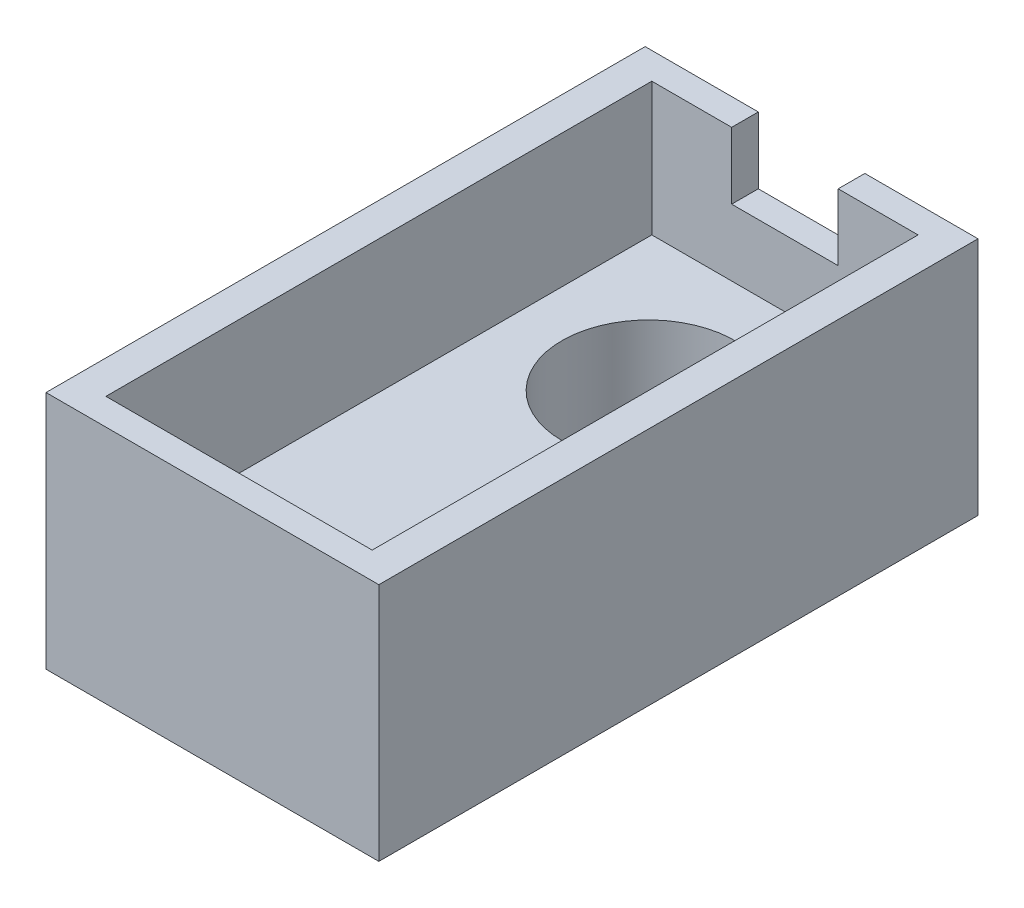
ISO-10303-21;
HEADER;
FILE_DESCRIPTION(('STEP AP214'),'2;1');
FILE_NAME('part.step','',(''),(''),'','','');
FILE_SCHEMA(('AUTOMOTIVE_DESIGN { 1 0 10303 214 1 1 1 1 }'));
ENDSEC;
DATA;
#1=APPLICATION_CONTEXT('core data for automotive mechanical design processes');
#2=APPLICATION_PROTOCOL_DEFINITION('international standard','automotive_design',2000,#1);
#3=PRODUCT_CONTEXT('',#1,'mechanical');
#4=PRODUCT('Part','Part','',(#3));
#5=PRODUCT_RELATED_PRODUCT_CATEGORY('part','',(#4));
#6=PRODUCT_DEFINITION_FORMATION('','',#4);
#7=PRODUCT_DEFINITION_CONTEXT('part definition',#1,'design');
#8=PRODUCT_DEFINITION('design','',#6,#7);
#9=PRODUCT_DEFINITION_SHAPE('','',#8);
#10=(LENGTH_UNIT() NAMED_UNIT(*) SI_UNIT(.MILLI.,.METRE.));
#11=(NAMED_UNIT(*) PLANE_ANGLE_UNIT() SI_UNIT($,.RADIAN.));
#12=(NAMED_UNIT(*) SI_UNIT($,.STERADIAN.) SOLID_ANGLE_UNIT());
#13=UNCERTAINTY_MEASURE_WITH_UNIT(LENGTH_MEASURE(1.E-05),#10,'distance_accuracy_value','');
#14=(GEOMETRIC_REPRESENTATION_CONTEXT(3) GLOBAL_UNCERTAINTY_ASSIGNED_CONTEXT((#13)) GLOBAL_UNIT_ASSIGNED_CONTEXT((#10,
#11,#12)) REPRESENTATION_CONTEXT('',''));
#15=CARTESIAN_POINT('',(0.,0.,0.));
#16=DIRECTION('',(0.,0.,1.));
#17=DIRECTION('',(1.,0.,0.));
#18=AXIS2_PLACEMENT_3D('',#15,#16,#17);
#19=CARTESIAN_POINT('',(12.5,-4.24264068711929,-32.75));
#20=DIRECTION('',(0.,1.,0.));
#21=DIRECTION('',(0.,0.,1.));
#22=AXIS2_PLACEMENT_3D('',#19,#20,#21);
#23=CYLINDRICAL_SURFACE('',#22,1.5);
#24=CARTESIAN_POINT('',(12.5,0.,-32.75));
#25=DIRECTION('',(0.,-1.,0.));
#26=DIRECTION('',(0.,0.,-1.));
#27=AXIS2_PLACEMENT_3D('',#24,#25,#26);
#28=CIRCLE('',#27,1.5);
#29=CARTESIAN_POINT('',(12.5,0.,-34.25));
#30=VERTEX_POINT('',#29);
#31=EDGE_CURVE('E189',#30,#30,#28,.F.);
#32=ORIENTED_EDGE('',*,*,#31,.F.);
#33=EDGE_LOOP('',(#32));
#34=FACE_BOUND('',#33,.T.);
#35=CARTESIAN_POINT('',(12.5,1.,-32.75));
#36=DIRECTION('',(0.,1.,0.));
#37=DIRECTION('',(0.,0.,1.));
#38=AXIS2_PLACEMENT_3D('',#35,#36,#37);
#39=CIRCLE('',#38,1.5);
#40=CARTESIAN_POINT('',(12.5,1.,-31.25));
#41=VERTEX_POINT('',#40);
#42=EDGE_CURVE('E39',#41,#41,#39,.F.);
#43=ORIENTED_EDGE('',*,*,#42,.F.);
#44=EDGE_LOOP('',(#43));
#45=FACE_BOUND('',#44,.T.);
#46=ADVANCED_FACE('F35',(#34,#45),#23,.F.);
#47=CARTESIAN_POINT('',(0.,13.,0.));
#48=DIRECTION('',(1.,0.,0.));
#49=DIRECTION('',(0.,0.,-1.));
#50=AXIS2_PLACEMENT_3D('',#47,#48,#49);
#51=PLANE('',#50);
#52=DIRECTION('',(0.,0.,1.));
#53=VECTOR('',#52,1.);
#54=CARTESIAN_POINT('',(0.,0.,0.));
#55=LINE('',#54,#53);
#56=CARTESIAN_POINT('',(0.,0.,-45.));
#57=VERTEX_POINT('',#56);
#58=CARTESIAN_POINT('',(0.,0.,0.));
#59=VERTEX_POINT('',#58);
#60=EDGE_CURVE('E210',#57,#59,#55,.T.);
#61=ORIENTED_EDGE('',*,*,#60,.T.);
#62=DIRECTION('',(0.,-1.,0.));
#63=VECTOR('',#62,1.);
#64=CARTESIAN_POINT('',(0.,13.,0.));
#65=LINE('',#64,#63);
#66=CARTESIAN_POINT('',(0.,18.,0.));
#67=VERTEX_POINT('',#66);
#68=EDGE_CURVE('E11',#67,#59,#65,.T.);
#69=ORIENTED_EDGE('',*,*,#68,.F.);
#70=DIRECTION('',(0.,0.,1.));
#71=VECTOR('',#70,1.);
#72=CARTESIAN_POINT('',(0.,18.,0.));
#73=LINE('',#72,#71);
#74=CARTESIAN_POINT('',(0.,18.,-45.));
#75=VERTEX_POINT('',#74);
#76=EDGE_CURVE('E146',#75,#67,#73,.T.);
#77=ORIENTED_EDGE('',*,*,#76,.F.);
#78=DIRECTION('',(0.,-1.,0.));
#79=VECTOR('',#78,1.);
#80=CARTESIAN_POINT('',(0.,13.,-45.));
#81=LINE('',#80,#79);
#82=EDGE_CURVE('E142',#75,#57,#81,.T.);
#83=ORIENTED_EDGE('',*,*,#82,.T.);
#84=EDGE_LOOP('',(#61,#69,#77,#83));
#85=FACE_BOUND('',#84,.T.);
#86=ADVANCED_FACE('F37',(#85),#51,.F.);
#87=CARTESIAN_POINT('',(0.,13.,0.));
#88=DIRECTION('',(0.,0.,-1.));
#89=DIRECTION('',(-1.,0.,0.));
#90=AXIS2_PLACEMENT_3D('',#87,#88,#89);
#91=PLANE('',#90);
#92=DIRECTION('',(1.,0.,0.));
#93=VECTOR('',#92,1.);
#94=CARTESIAN_POINT('',(0.,0.,0.));
#95=LINE('',#94,#93);
#96=CARTESIAN_POINT('',(25.,0.,0.));
#97=VERTEX_POINT('',#96);
#98=EDGE_CURVE('E220',#59,#97,#95,.T.);
#99=ORIENTED_EDGE('',*,*,#98,.T.);
#100=DIRECTION('',(0.,-1.,0.));
#101=VECTOR('',#100,1.);
#102=CARTESIAN_POINT('',(25.,13.,0.));
#103=LINE('',#102,#101);
#104=CARTESIAN_POINT('',(25.,18.,0.));
#105=VERTEX_POINT('',#104);
#106=EDGE_CURVE('E44',#105,#97,#103,.T.);
#107=ORIENTED_EDGE('',*,*,#106,.F.);
#108=DIRECTION('',(1.,0.,0.));
#109=VECTOR('',#108,1.);
#110=CARTESIAN_POINT('',(0.,18.,0.));
#111=LINE('',#110,#109);
#112=EDGE_CURVE('E159',#67,#105,#111,.T.);
#113=ORIENTED_EDGE('',*,*,#112,.F.);
#114=ORIENTED_EDGE('',*,*,#68,.T.);
#115=EDGE_LOOP('',(#99,#107,#113,#114));
#116=FACE_BOUND('',#115,.T.);
#117=ADVANCED_FACE('F239',(#116),#91,.F.);
#118=CARTESIAN_POINT('',(25.,13.,0.));
#119=DIRECTION('',(-1.,0.,0.));
#120=DIRECTION('',(0.,0.,1.));
#121=AXIS2_PLACEMENT_3D('',#118,#119,#120);
#122=PLANE('',#121);
#123=DIRECTION('',(0.,0.,-1.));
#124=VECTOR('',#123,1.);
#125=CARTESIAN_POINT('',(25.,0.,0.));
#126=LINE('',#125,#124);
#127=CARTESIAN_POINT('',(25.,0.,-45.));
#128=VERTEX_POINT('',#127);
#129=EDGE_CURVE('E222',#97,#128,#126,.T.);
#130=ORIENTED_EDGE('',*,*,#129,.T.);
#131=DIRECTION('',(0.,-1.,0.));
#132=VECTOR('',#131,1.);
#133=CARTESIAN_POINT('',(25.,13.,-45.));
#134=LINE('',#133,#132);
#135=CARTESIAN_POINT('',(25.,18.,-45.));
#136=VERTEX_POINT('',#135);
#137=EDGE_CURVE('E226',#136,#128,#134,.T.);
#138=ORIENTED_EDGE('',*,*,#137,.F.);
#139=DIRECTION('',(0.,0.,-1.));
#140=VECTOR('',#139,1.);
#141=CARTESIAN_POINT('',(25.,18.,0.));
#142=LINE('',#141,#140);
#143=EDGE_CURVE('E162',#105,#136,#142,.T.);
#144=ORIENTED_EDGE('',*,*,#143,.F.);
#145=ORIENTED_EDGE('',*,*,#106,.T.);
#146=EDGE_LOOP('',(#130,#138,#144,#145));
#147=FACE_BOUND('',#146,.T.);
#148=ADVANCED_FACE('F232',(#147),#122,.F.);
#149=CARTESIAN_POINT('',(0.,13.,-45.));
#150=DIRECTION('',(0.,0.,1.));
#151=DIRECTION('',(1.,0.,0.));
#152=AXIS2_PLACEMENT_3D('',#149,#150,#151);
#153=PLANE('',#152);
#154=DIRECTION('',(-1.,0.,0.));
#155=VECTOR('',#154,1.);
#156=CARTESIAN_POINT('',(0.,0.,-45.));
#157=LINE('',#156,#155);
#158=EDGE_CURVE('E59',#128,#57,#157,.T.);
#159=ORIENTED_EDGE('',*,*,#158,.T.);
#160=ORIENTED_EDGE('',*,*,#82,.F.);
#161=DIRECTION('',(-1.,0.,0.));
#162=VECTOR('',#161,1.);
#163=CARTESIAN_POINT('',(0.,18.,-45.));
#164=LINE('',#163,#162);
#165=CARTESIAN_POINT('',(8.49999999999999,18.,-45.));
#166=VERTEX_POINT('',#165);
#167=EDGE_CURVE('E140',#166,#75,#164,.T.);
#168=ORIENTED_EDGE('',*,*,#167,.F.);
#169=DIRECTION('',(0.,-1.,0.));
#170=VECTOR('',#169,1.);
#171=CARTESIAN_POINT('',(8.49999999999999,18.,-45.));
#172=LINE('',#171,#170);
#173=CARTESIAN_POINT('',(8.49999999999999,13.,-45.));
#174=VERTEX_POINT('',#173);
#175=EDGE_CURVE('E128',#166,#174,#172,.T.);
#176=ORIENTED_EDGE('',*,*,#175,.T.);
#177=DIRECTION('',(-1.,0.,0.));
#178=VECTOR('',#177,1.);
#179=CARTESIAN_POINT('',(0.,13.,-45.));
#180=LINE('',#179,#178);
#181=CARTESIAN_POINT('',(16.5,13.,-45.));
#182=VERTEX_POINT('',#181);
#183=EDGE_CURVE('E216',#182,#174,#180,.T.);
#184=ORIENTED_EDGE('',*,*,#183,.F.);
#185=DIRECTION('',(0.,-1.,0.));
#186=VECTOR('',#185,1.);
#187=CARTESIAN_POINT('',(16.5,18.,-45.));
#188=LINE('',#187,#186);
#189=CARTESIAN_POINT('',(16.5,18.,-45.));
#190=VERTEX_POINT('',#189);
#191=EDGE_CURVE('E51',#190,#182,#188,.T.);
#192=ORIENTED_EDGE('',*,*,#191,.F.);
#193=EDGE_CURVE('E148',#136,#190,#164,.T.);
#194=ORIENTED_EDGE('',*,*,#193,.F.);
#195=ORIENTED_EDGE('',*,*,#137,.T.);
#196=EDGE_LOOP('',(#159,#160,#168,#176,#184,#192,#194,#195));
#197=FACE_BOUND('',#196,.T.);
#198=ADVANCED_FACE('F141',(#197),#153,.F.);
#199=CARTESIAN_POINT('',(0.,13.,0.));
#200=DIRECTION('',(0.,-1.,0.));
#201=DIRECTION('',(0.,0.,-1.));
#202=AXIS2_PLACEMENT_3D('',#199,#200,#201);
#203=PLANE('',#202);
#204=ORIENTED_EDGE('',*,*,#183,.T.);
#205=DIRECTION('',(0.,0.,1.));
#206=VECTOR('',#205,1.);
#207=CARTESIAN_POINT('',(8.49999999999999,13.,0.));
#208=LINE('',#207,#206);
#209=CARTESIAN_POINT('',(8.49999999999999,13.,-43.));
#210=VERTEX_POINT('',#209);
#211=EDGE_CURVE('E134',#174,#210,#208,.T.);
#212=ORIENTED_EDGE('',*,*,#211,.T.);
#213=DIRECTION('',(-1.,0.,0.));
#214=VECTOR('',#213,1.);
#215=CARTESIAN_POINT('',(2.49999999999999,13.,-43.));
#216=LINE('',#215,#214);
#217=CARTESIAN_POINT('',(16.5,13.,-43.));
#218=VERTEX_POINT('',#217);
#219=EDGE_CURVE('E192',#218,#210,#216,.T.);
#220=ORIENTED_EDGE('',*,*,#219,.F.);
#221=DIRECTION('',(0.,0.,-1.));
#222=VECTOR('',#221,1.);
#223=CARTESIAN_POINT('',(16.5,13.,0.));
#224=LINE('',#223,#222);
#225=EDGE_CURVE('E154',#218,#182,#224,.T.);
#226=ORIENTED_EDGE('',*,*,#225,.T.);
#227=EDGE_LOOP('',(#204,#212,#220,#226));
#228=FACE_BOUND('',#227,.T.);
#229=ADVANCED_FACE('F278',(#228),#203,.F.);
#230=CARTESIAN_POINT('',(0.,0.,0.));
#231=DIRECTION('',(0.,-1.,0.));
#232=DIRECTION('',(0.,0.,-1.));
#233=AXIS2_PLACEMENT_3D('',#230,#231,#232);
#234=PLANE('',#233);
#235=ORIENTED_EDGE('',*,*,#31,.T.);
#236=EDGE_LOOP('',(#235));
#237=FACE_BOUND('',#236,.T.);
#238=ORIENTED_EDGE('',*,*,#60,.F.);
#239=ORIENTED_EDGE('',*,*,#158,.F.);
#240=ORIENTED_EDGE('',*,*,#129,.F.);
#241=ORIENTED_EDGE('',*,*,#98,.F.);
#242=EDGE_LOOP('',(#238,#239,#240,#241));
#243=FACE_BOUND('',#242,.T.);
#244=ADVANCED_FACE('F237',(#237,#243),#234,.T.);
#245=CARTESIAN_POINT('',(2.49999999999999,8.,-2.));
#246=DIRECTION('',(-1.,0.,0.));
#247=DIRECTION('',(0.,0.,1.));
#248=AXIS2_PLACEMENT_3D('',#245,#246,#247);
#249=PLANE('',#248);
#250=DIRECTION('',(0.,1.,0.));
#251=VECTOR('',#250,1.);
#252=CARTESIAN_POINT('',(2.49999999999999,8.,-43.));
#253=LINE('',#252,#251);
#254=CARTESIAN_POINT('',(2.49999999999999,8.,-43.));
#255=VERTEX_POINT('',#254);
#256=CARTESIAN_POINT('',(2.49999999999999,18.,-43.));
#257=VERTEX_POINT('',#256);
#258=EDGE_CURVE('E208',#255,#257,#253,.T.);
#259=ORIENTED_EDGE('',*,*,#258,.T.);
#260=DIRECTION('',(0.,0.,-1.));
#261=VECTOR('',#260,1.);
#262=CARTESIAN_POINT('',(2.49999999999999,18.,0.));
#263=LINE('',#262,#261);
#264=CARTESIAN_POINT('',(2.49999999999999,18.,-2.));
#265=VERTEX_POINT('',#264);
#266=EDGE_CURVE('E176',#265,#257,#263,.T.);
#267=ORIENTED_EDGE('',*,*,#266,.F.);
#268=DIRECTION('',(0.,1.,0.));
#269=VECTOR('',#268,1.);
#270=CARTESIAN_POINT('',(2.49999999999999,8.,-2.));
#271=LINE('',#270,#269);
#272=CARTESIAN_POINT('',(2.49999999999999,8.,-2.));
#273=VERTEX_POINT('',#272);
#274=EDGE_CURVE('E205',#273,#265,#271,.T.);
#275=ORIENTED_EDGE('',*,*,#274,.F.);
#276=DIRECTION('',(0.,0.,1.));
#277=VECTOR('',#276,1.);
#278=CARTESIAN_POINT('',(2.49999999999999,8.,-2.));
#279=LINE('',#278,#277);
#280=EDGE_CURVE('E193',#255,#273,#279,.T.);
#281=ORIENTED_EDGE('',*,*,#280,.F.);
#282=EDGE_LOOP('',(#259,#267,#275,#281));
#283=FACE_BOUND('',#282,.T.);
#284=ADVANCED_FACE('F267',(#283),#249,.F.);
#285=CARTESIAN_POINT('',(2.49999999999999,8.,-43.));
#286=DIRECTION('',(0.,0.,-1.));
#287=DIRECTION('',(-1.,0.,0.));
#288=AXIS2_PLACEMENT_3D('',#285,#286,#287);
#289=PLANE('',#288);
#290=DIRECTION('',(0.,1.,0.));
#291=VECTOR('',#290,1.);
#292=CARTESIAN_POINT('',(22.5,8.,-43.));
#293=LINE('',#292,#291);
#294=CARTESIAN_POINT('',(22.5,8.,-43.));
#295=VERTEX_POINT('',#294);
#296=CARTESIAN_POINT('',(22.5,18.,-43.));
#297=VERTEX_POINT('',#296);
#298=EDGE_CURVE('E211',#295,#297,#293,.T.);
#299=ORIENTED_EDGE('',*,*,#298,.T.);
#300=DIRECTION('',(1.,0.,0.));
#301=VECTOR('',#300,1.);
#302=CARTESIAN_POINT('',(0.,18.,-43.));
#303=LINE('',#302,#301);
#304=CARTESIAN_POINT('',(16.5,18.,-43.));
#305=VERTEX_POINT('',#304);
#306=EDGE_CURVE('E167',#305,#297,#303,.T.);
#307=ORIENTED_EDGE('',*,*,#306,.F.);
#308=DIRECTION('',(0.,-1.,0.));
#309=VECTOR('',#308,1.);
#310=CARTESIAN_POINT('',(16.5,18.,-43.));
#311=LINE('',#310,#309);
#312=EDGE_CURVE('E181',#305,#218,#311,.T.);
#313=ORIENTED_EDGE('',*,*,#312,.T.);
#314=ORIENTED_EDGE('',*,*,#219,.T.);
#315=DIRECTION('',(0.,-1.,0.));
#316=VECTOR('',#315,1.);
#317=CARTESIAN_POINT('',(8.49999999999999,18.,-43.));
#318=LINE('',#317,#316);
#319=CARTESIAN_POINT('',(8.49999999999999,18.,-43.));
#320=VERTEX_POINT('',#319);
#321=EDGE_CURVE('E179',#320,#210,#318,.T.);
#322=ORIENTED_EDGE('',*,*,#321,.F.);
#323=EDGE_CURVE('E152',#257,#320,#303,.T.);
#324=ORIENTED_EDGE('',*,*,#323,.F.);
#325=ORIENTED_EDGE('',*,*,#258,.F.);
#326=DIRECTION('',(-1.,0.,0.));
#327=VECTOR('',#326,1.);
#328=CARTESIAN_POINT('',(2.49999999999999,8.,-43.));
#329=LINE('',#328,#327);
#330=EDGE_CURVE('E202',#295,#255,#329,.T.);
#331=ORIENTED_EDGE('',*,*,#330,.F.);
#332=EDGE_LOOP('',(#299,#307,#313,#314,#322,#324,#325,#331));
#333=FACE_BOUND('',#332,.T.);
#334=ADVANCED_FACE('F263',(#333),#289,.F.);
#335=CARTESIAN_POINT('',(22.5,8.,-2.));
#336=DIRECTION('',(1.,0.,0.));
#337=DIRECTION('',(0.,0.,-1.));
#338=AXIS2_PLACEMENT_3D('',#335,#336,#337);
#339=PLANE('',#338);
#340=DIRECTION('',(0.,1.,0.));
#341=VECTOR('',#340,1.);
#342=CARTESIAN_POINT('',(22.5,8.,-2.));
#343=LINE('',#342,#341);
#344=CARTESIAN_POINT('',(22.5,8.,-2.));
#345=VERTEX_POINT('',#344);
#346=CARTESIAN_POINT('',(22.5,18.,-2.));
#347=VERTEX_POINT('',#346);
#348=EDGE_CURVE('E213',#345,#347,#343,.T.);
#349=ORIENTED_EDGE('',*,*,#348,.T.);
#350=DIRECTION('',(0.,0.,1.));
#351=VECTOR('',#350,1.);
#352=CARTESIAN_POINT('',(22.5,18.,0.));
#353=LINE('',#352,#351);
#354=EDGE_CURVE('E170',#297,#347,#353,.T.);
#355=ORIENTED_EDGE('',*,*,#354,.F.);
#356=ORIENTED_EDGE('',*,*,#298,.F.);
#357=DIRECTION('',(0.,0.,-1.));
#358=VECTOR('',#357,1.);
#359=CARTESIAN_POINT('',(22.5,8.,-2.));
#360=LINE('',#359,#358);
#361=EDGE_CURVE('E199',#345,#295,#360,.T.);
#362=ORIENTED_EDGE('',*,*,#361,.F.);
#363=EDGE_LOOP('',(#349,#355,#356,#362));
#364=FACE_BOUND('',#363,.T.);
#365=ADVANCED_FACE('F266',(#364),#339,.F.);
#366=CARTESIAN_POINT('',(2.49999999999999,8.,-2.));
#367=DIRECTION('',(0.,0.,1.));
#368=DIRECTION('',(1.,0.,0.));
#369=AXIS2_PLACEMENT_3D('',#366,#367,#368);
#370=PLANE('',#369);
#371=ORIENTED_EDGE('',*,*,#274,.T.);
#372=DIRECTION('',(-1.,0.,0.));
#373=VECTOR('',#372,1.);
#374=CARTESIAN_POINT('',(0.,18.,-2.));
#375=LINE('',#374,#373);
#376=EDGE_CURVE('E173',#347,#265,#375,.T.);
#377=ORIENTED_EDGE('',*,*,#376,.F.);
#378=ORIENTED_EDGE('',*,*,#348,.F.);
#379=DIRECTION('',(1.,0.,0.));
#380=VECTOR('',#379,1.);
#381=CARTESIAN_POINT('',(2.49999999999999,8.,-2.));
#382=LINE('',#381,#380);
#383=EDGE_CURVE('E196',#273,#345,#382,.T.);
#384=ORIENTED_EDGE('',*,*,#383,.F.);
#385=EDGE_LOOP('',(#371,#377,#378,#384));
#386=FACE_BOUND('',#385,.T.);
#387=ADVANCED_FACE('F261',(#386),#370,.F.);
#388=CARTESIAN_POINT('',(0.,8.,0.));
#389=DIRECTION('',(0.,-1.,0.));
#390=DIRECTION('',(0.,0.,-1.));
#391=AXIS2_PLACEMENT_3D('',#388,#389,#390);
#392=PLANE('',#391);
#393=CARTESIAN_POINT('',(12.5,8.,-32.75));
#394=DIRECTION('',(0.,1.,0.));
#395=DIRECTION('',(0.,0.,1.));
#396=AXIS2_PLACEMENT_3D('',#393,#394,#395);
#397=CIRCLE('',#396,6.5);
#398=CARTESIAN_POINT('',(12.5,8.,-26.25));
#399=VERTEX_POINT('',#398);
#400=EDGE_CURVE('E137',#399,#399,#397,.T.);
#401=ORIENTED_EDGE('',*,*,#400,.F.);
#402=EDGE_LOOP('',(#401));
#403=FACE_BOUND('',#402,.T.);
#404=ORIENTED_EDGE('',*,*,#280,.T.);
#405=ORIENTED_EDGE('',*,*,#383,.T.);
#406=ORIENTED_EDGE('',*,*,#361,.T.);
#407=ORIENTED_EDGE('',*,*,#330,.T.);
#408=EDGE_LOOP('',(#404,#405,#406,#407));
#409=FACE_BOUND('',#408,.T.);
#410=ADVANCED_FACE('F257',(#403,#409),#392,.F.);
#411=CARTESIAN_POINT('',(12.5,1.,-32.75));
#412=DIRECTION('',(0.,1.,0.));
#413=DIRECTION('',(0.,0.,1.));
#414=AXIS2_PLACEMENT_3D('',#411,#412,#413);
#415=PLANE('',#414);
#416=CARTESIAN_POINT('',(12.5,1.,-32.75));
#417=DIRECTION('',(0.,1.,0.));
#418=DIRECTION('',(0.,0.,1.));
#419=AXIS2_PLACEMENT_3D('',#416,#417,#418);
#420=CIRCLE('',#419,6.5);
#421=CARTESIAN_POINT('',(12.5,1.,-26.25));
#422=VERTEX_POINT('',#421);
#423=EDGE_CURVE('E184',#422,#422,#420,.T.);
#424=ORIENTED_EDGE('',*,*,#423,.T.);
#425=EDGE_LOOP('',(#424));
#426=FACE_BOUND('',#425,.T.);
#427=ORIENTED_EDGE('',*,*,#42,.T.);
#428=EDGE_LOOP('',(#427));
#429=FACE_BOUND('',#428,.T.);
#430=ADVANCED_FACE('F260',(#426,#429),#415,.T.);
#431=CARTESIAN_POINT('',(12.5,1.,-32.75));
#432=DIRECTION('',(0.,1.,0.));
#433=DIRECTION('',(0.,0.,1.));
#434=AXIS2_PLACEMENT_3D('',#431,#432,#433);
#435=CYLINDRICAL_SURFACE('',#434,6.5);
#436=ORIENTED_EDGE('',*,*,#423,.F.);
#437=EDGE_LOOP('',(#436));
#438=FACE_BOUND('',#437,.T.);
#439=ORIENTED_EDGE('',*,*,#400,.T.);
#440=EDGE_LOOP('',(#439));
#441=FACE_BOUND('',#440,.T.);
#442=ADVANCED_FACE('F255',(#438,#441),#435,.F.);
#443=CARTESIAN_POINT('',(8.49999999999999,18.,0.));
#444=DIRECTION('',(1.,0.,0.));
#445=DIRECTION('',(0.,0.,-1.));
#446=AXIS2_PLACEMENT_3D('',#443,#444,#445);
#447=PLANE('',#446);
#448=ORIENTED_EDGE('',*,*,#211,.F.);
#449=ORIENTED_EDGE('',*,*,#175,.F.);
#450=DIRECTION('',(0.,0.,1.));
#451=VECTOR('',#450,1.);
#452=CARTESIAN_POINT('',(8.49999999999999,18.,0.));
#453=LINE('',#452,#451);
#454=EDGE_CURVE('E132',#166,#320,#453,.T.);
#455=ORIENTED_EDGE('',*,*,#454,.T.);
#456=ORIENTED_EDGE('',*,*,#321,.T.);
#457=EDGE_LOOP('',(#448,#449,#455,#456));
#458=FACE_BOUND('',#457,.T.);
#459=ADVANCED_FACE('F130',(#458),#447,.T.);
#460=CARTESIAN_POINT('',(16.5,18.,0.));
#461=DIRECTION('',(-1.,0.,0.));
#462=DIRECTION('',(0.,0.,1.));
#463=AXIS2_PLACEMENT_3D('',#460,#461,#462);
#464=PLANE('',#463);
#465=ORIENTED_EDGE('',*,*,#225,.F.);
#466=ORIENTED_EDGE('',*,*,#312,.F.);
#467=DIRECTION('',(0.,0.,-1.));
#468=VECTOR('',#467,1.);
#469=CARTESIAN_POINT('',(16.5,18.,0.));
#470=LINE('',#469,#468);
#471=EDGE_CURVE('E165',#305,#190,#470,.T.);
#472=ORIENTED_EDGE('',*,*,#471,.T.);
#473=ORIENTED_EDGE('',*,*,#191,.T.);
#474=EDGE_LOOP('',(#465,#466,#472,#473));
#475=FACE_BOUND('',#474,.T.);
#476=ADVANCED_FACE('F337',(#475),#464,.T.);
#477=CARTESIAN_POINT('',(0.,18.,0.));
#478=DIRECTION('',(0.,1.,0.));
#479=DIRECTION('',(0.,0.,1.));
#480=AXIS2_PLACEMENT_3D('',#477,#478,#479);
#481=PLANE('',#480);
#482=ORIENTED_EDGE('',*,*,#454,.F.);
#483=ORIENTED_EDGE('',*,*,#167,.T.);
#484=ORIENTED_EDGE('',*,*,#76,.T.);
#485=ORIENTED_EDGE('',*,*,#112,.T.);
#486=ORIENTED_EDGE('',*,*,#143,.T.);
#487=ORIENTED_EDGE('',*,*,#193,.T.);
#488=ORIENTED_EDGE('',*,*,#471,.F.);
#489=ORIENTED_EDGE('',*,*,#306,.T.);
#490=ORIENTED_EDGE('',*,*,#354,.T.);
#491=ORIENTED_EDGE('',*,*,#376,.T.);
#492=ORIENTED_EDGE('',*,*,#266,.T.);
#493=ORIENTED_EDGE('',*,*,#323,.T.);
#494=EDGE_LOOP('',(#482,#483,#484,#485,#486,#487,#488,#489,#490,#491,#492,#493));
#495=FACE_BOUND('',#494,.T.);
#496=ADVANCED_FACE('F149',(#495),#481,.T.);
#497=CLOSED_SHELL('',(#46,#86,#117,#148,#198,#229,#244,#284,#334,#365,#387,#410,#430,#442,#459,
#476,#496));
#498=MANIFOLD_SOLID_BREP('B2',#497);
#499=ADVANCED_BREP_SHAPE_REPRESENTATION('',(#18,#498),#14);
#500=SHAPE_DEFINITION_REPRESENTATION(#9,#499);
ENDSEC;
END-ISO-10303-21;
